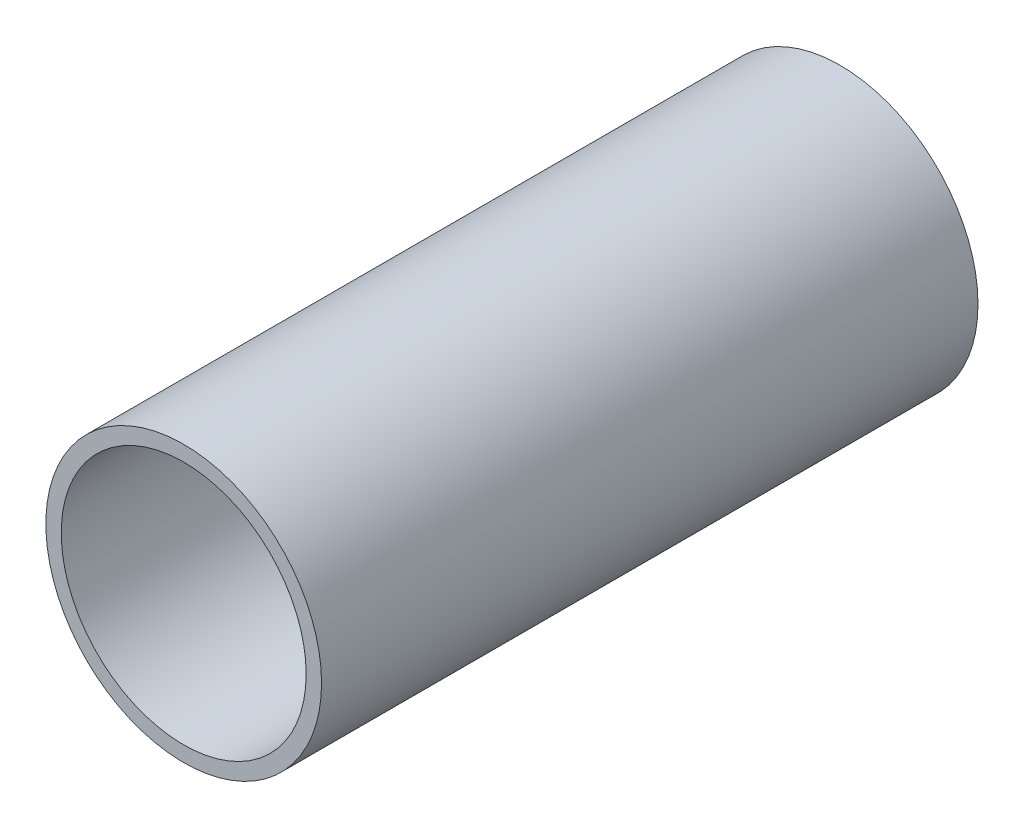
ISO-10303-21;
HEADER;
FILE_DESCRIPTION(('STEP AP214'),'2;1');
FILE_NAME('part.step','',(''),(''),'','','');
FILE_SCHEMA(('AUTOMOTIVE_DESIGN { 1 0 10303 214 1 1 1 1 }'));
ENDSEC;
DATA;
#1=APPLICATION_CONTEXT('core data for automotive mechanical design processes');
#2=APPLICATION_PROTOCOL_DEFINITION('international standard','automotive_design',2000,#1);
#3=PRODUCT_CONTEXT('',#1,'mechanical');
#4=PRODUCT('Part','Part','',(#3));
#5=PRODUCT_RELATED_PRODUCT_CATEGORY('part','',(#4));
#6=PRODUCT_DEFINITION_FORMATION('','',#4);
#7=PRODUCT_DEFINITION_CONTEXT('part definition',#1,'design');
#8=PRODUCT_DEFINITION('design','',#6,#7);
#9=PRODUCT_DEFINITION_SHAPE('','',#8);
#10=(LENGTH_UNIT() NAMED_UNIT(*) SI_UNIT(.MILLI.,.METRE.));
#11=(NAMED_UNIT(*) PLANE_ANGLE_UNIT() SI_UNIT($,.RADIAN.));
#12=(NAMED_UNIT(*) SI_UNIT($,.STERADIAN.) SOLID_ANGLE_UNIT());
#13=UNCERTAINTY_MEASURE_WITH_UNIT(LENGTH_MEASURE(1.E-05),#10,'distance_accuracy_value','');
#14=(GEOMETRIC_REPRESENTATION_CONTEXT(3) GLOBAL_UNCERTAINTY_ASSIGNED_CONTEXT((#13)) GLOBAL_UNIT_ASSIGNED_CONTEXT((#10,
#11,#12)) REPRESENTATION_CONTEXT('',''));
#15=CARTESIAN_POINT('',(0.,0.,0.));
#16=DIRECTION('',(0.,0.,1.));
#17=DIRECTION('',(1.,0.,0.));
#18=AXIS2_PLACEMENT_3D('',#15,#16,#17);
#19=CARTESIAN_POINT('',(0.,0.,100.));
#20=DIRECTION('',(0.,0.,1.));
#21=DIRECTION('',(1.,0.,0.));
#22=AXIS2_PLACEMENT_3D('',#19,#20,#21);
#23=PLANE('',#22);
#24=CARTESIAN_POINT('',(0.,0.,100.));
#25=DIRECTION('',(0.,0.,1.));
#26=DIRECTION('',(1.,0.,0.));
#27=AXIS2_PLACEMENT_3D('',#24,#25,#26);
#28=CIRCLE('',#27,21.);
#29=CARTESIAN_POINT('',(21.,0.,100.));
#30=VERTEX_POINT('',#29);
#31=EDGE_CURVE('E10',#30,#30,#28,.T.);
#32=ORIENTED_EDGE('',*,*,#31,.T.);
#33=EDGE_LOOP('',(#32));
#34=FACE_BOUND('',#33,.T.);
#35=CARTESIAN_POINT('',(0.,0.,100.));
#36=DIRECTION('',(0.,0.,1.));
#37=DIRECTION('',(1.,0.,0.));
#38=AXIS2_PLACEMENT_3D('',#35,#36,#37);
#39=CIRCLE('',#38,18.6557873257764);
#40=CARTESIAN_POINT('',(18.6557873257764,0.,100.));
#41=VERTEX_POINT('',#40);
#42=EDGE_CURVE('E42',#41,#41,#39,.T.);
#43=ORIENTED_EDGE('',*,*,#42,.F.);
#44=EDGE_LOOP('',(#43));
#45=FACE_BOUND('',#44,.T.);
#46=ADVANCED_FACE('F31',(#34,#45),#23,.T.);
#47=CARTESIAN_POINT('',(0.,0.,0.));
#48=DIRECTION('',(0.,0.,1.));
#49=DIRECTION('',(1.,0.,0.));
#50=AXIS2_PLACEMENT_3D('',#47,#48,#49);
#51=PLANE('',#50);
#52=CARTESIAN_POINT('',(0.,0.,0.));
#53=DIRECTION('',(0.,0.,1.));
#54=DIRECTION('',(1.,0.,0.));
#55=AXIS2_PLACEMENT_3D('',#52,#53,#54);
#56=CIRCLE('',#55,21.);
#57=CARTESIAN_POINT('',(21.,0.,0.));
#58=VERTEX_POINT('',#57);
#59=EDGE_CURVE('E35',#58,#58,#56,.T.);
#60=ORIENTED_EDGE('',*,*,#59,.F.);
#61=EDGE_LOOP('',(#60));
#62=FACE_BOUND('',#61,.T.);
#63=CARTESIAN_POINT('',(0.,0.,0.));
#64=DIRECTION('',(0.,0.,1.));
#65=DIRECTION('',(1.,0.,0.));
#66=AXIS2_PLACEMENT_3D('',#63,#64,#65);
#67=CIRCLE('',#66,18.6557873257764);
#68=CARTESIAN_POINT('',(18.6557873257764,0.,0.));
#69=VERTEX_POINT('',#68);
#70=EDGE_CURVE('E44',#69,#69,#67,.T.);
#71=ORIENTED_EDGE('',*,*,#70,.T.);
#72=EDGE_LOOP('',(#71));
#73=FACE_BOUND('',#72,.T.);
#74=ADVANCED_FACE('F54',(#62,#73),#51,.F.);
#75=CARTESIAN_POINT('',(0.,0.,100.));
#76=DIRECTION('',(0.,0.,-1.));
#77=DIRECTION('',(-1.,0.,0.));
#78=AXIS2_PLACEMENT_3D('',#75,#76,#77);
#79=CYLINDRICAL_SURFACE('',#78,21.);
#80=ORIENTED_EDGE('',*,*,#31,.F.);
#81=EDGE_LOOP('',(#80));
#82=FACE_BOUND('',#81,.T.);
#83=ORIENTED_EDGE('',*,*,#59,.T.);
#84=EDGE_LOOP('',(#83));
#85=FACE_BOUND('',#84,.T.);
#86=ADVANCED_FACE('F33',(#82,#85),#79,.T.);
#87=CARTESIAN_POINT('',(0.,0.,100.));
#88=DIRECTION('',(0.,0.,-1.));
#89=DIRECTION('',(-1.,0.,0.));
#90=AXIS2_PLACEMENT_3D('',#87,#88,#89);
#91=CYLINDRICAL_SURFACE('',#90,18.6557873257764);
#92=ORIENTED_EDGE('',*,*,#42,.T.);
#93=EDGE_LOOP('',(#92));
#94=FACE_BOUND('',#93,.T.);
#95=ORIENTED_EDGE('',*,*,#70,.F.);
#96=EDGE_LOOP('',(#95));
#97=FACE_BOUND('',#96,.T.);
#98=ADVANCED_FACE('F50',(#94,#97),#91,.F.);
#99=CLOSED_SHELL('',(#46,#74,#86,#98));
#100=MANIFOLD_SOLID_BREP('B2',#99);
#101=ADVANCED_BREP_SHAPE_REPRESENTATION('',(#18,#100),#14);
#102=SHAPE_DEFINITION_REPRESENTATION(#9,#101);
ENDSEC;
END-ISO-10303-21;
